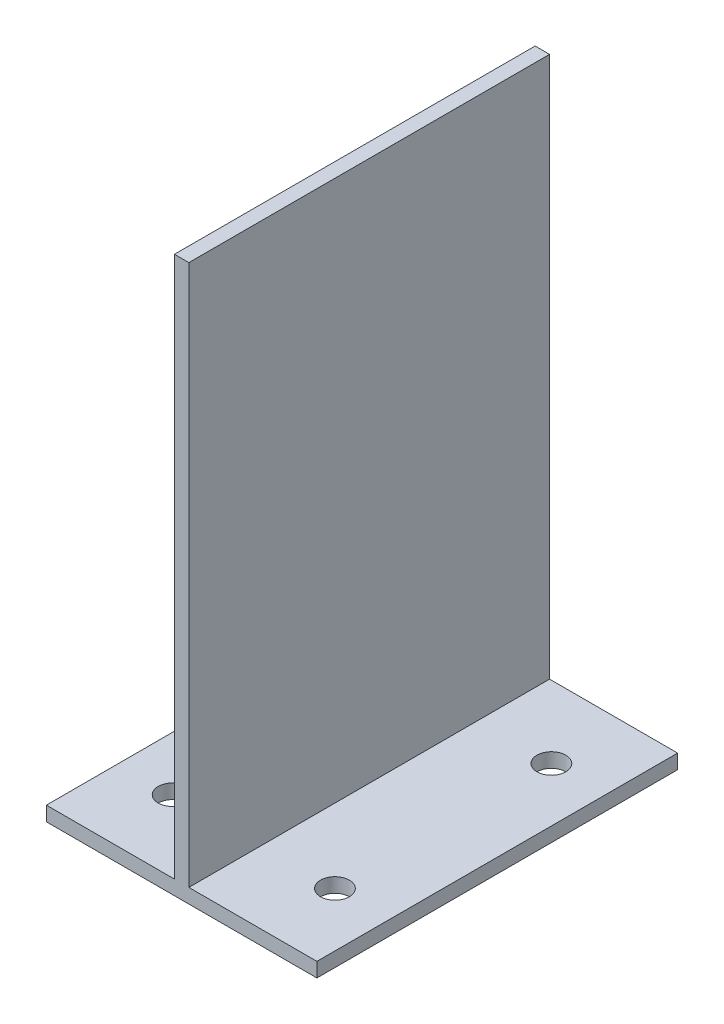
ISO-10303-21;
HEADER;
FILE_DESCRIPTION(('STEP AP214'),'2;1');
FILE_NAME('part.step','',(''),(''),'','','');
FILE_SCHEMA(('AUTOMOTIVE_DESIGN { 1 0 10303 214 1 1 1 1 }'));
ENDSEC;
DATA;
#1=APPLICATION_CONTEXT('core data for automotive mechanical design processes');
#2=APPLICATION_PROTOCOL_DEFINITION('international standard','automotive_design',2000,#1);
#3=PRODUCT_CONTEXT('',#1,'mechanical');
#4=PRODUCT('Part','Part','',(#3));
#5=PRODUCT_RELATED_PRODUCT_CATEGORY('part','',(#4));
#6=PRODUCT_DEFINITION_FORMATION('','',#4);
#7=PRODUCT_DEFINITION_CONTEXT('part definition',#1,'design');
#8=PRODUCT_DEFINITION('design','',#6,#7);
#9=PRODUCT_DEFINITION_SHAPE('','',#8);
#10=(LENGTH_UNIT() NAMED_UNIT(*) SI_UNIT(.MILLI.,.METRE.));
#11=(NAMED_UNIT(*) PLANE_ANGLE_UNIT() SI_UNIT($,.RADIAN.));
#12=(NAMED_UNIT(*) SI_UNIT($,.STERADIAN.) SOLID_ANGLE_UNIT());
#13=UNCERTAINTY_MEASURE_WITH_UNIT(LENGTH_MEASURE(1.E-05),#10,'distance_accuracy_value','');
#14=(GEOMETRIC_REPRESENTATION_CONTEXT(3) GLOBAL_UNCERTAINTY_ASSIGNED_CONTEXT((#13)) GLOBAL_UNIT_ASSIGNED_CONTEXT((#10,
#11,#12)) REPRESENTATION_CONTEXT('',''));
#15=CARTESIAN_POINT('',(0.,0.,0.));
#16=DIRECTION('',(0.,0.,1.));
#17=DIRECTION('',(1.,0.,0.));
#18=AXIS2_PLACEMENT_3D('',#15,#16,#17);
#19=CARTESIAN_POINT('',(4.,308.,200.));
#20=DIRECTION('',(0.,-1.,0.));
#21=DIRECTION('',(0.,0.,-1.));
#22=AXIS2_PLACEMENT_3D('',#19,#20,#21);
#23=PLANE('',#22);
#24=DIRECTION('',(-1.,0.,0.));
#25=VECTOR('',#24,1.);
#26=CARTESIAN_POINT('',(4.,308.,0.));
#27=LINE('',#26,#25);
#28=CARTESIAN_POINT('',(4.,308.,0.));
#29=VERTEX_POINT('',#28);
#30=CARTESIAN_POINT('',(-4.,308.,0.));
#31=VERTEX_POINT('',#30);
#32=EDGE_CURVE('E139',#29,#31,#27,.T.);
#33=ORIENTED_EDGE('',*,*,#32,.T.);
#34=DIRECTION('',(0.,0.,-1.));
#35=VECTOR('',#34,1.);
#36=CARTESIAN_POINT('',(-4.,308.,200.));
#37=LINE('',#36,#35);
#38=CARTESIAN_POINT('',(-4.,308.,200.));
#39=VERTEX_POINT('',#38);
#40=EDGE_CURVE('E11',#39,#31,#37,.T.);
#41=ORIENTED_EDGE('',*,*,#40,.F.);
#42=DIRECTION('',(-1.,0.,0.));
#43=VECTOR('',#42,1.);
#44=CARTESIAN_POINT('',(4.,308.,200.));
#45=LINE('',#44,#43);
#46=CARTESIAN_POINT('',(4.,308.,200.));
#47=VERTEX_POINT('',#46);
#48=EDGE_CURVE('E162',#47,#39,#45,.T.);
#49=ORIENTED_EDGE('',*,*,#48,.F.);
#50=DIRECTION('',(0.,0.,-1.));
#51=VECTOR('',#50,1.);
#52=CARTESIAN_POINT('',(4.,308.,200.));
#53=LINE('',#52,#51);
#54=EDGE_CURVE('E135',#47,#29,#53,.T.);
#55=ORIENTED_EDGE('',*,*,#54,.T.);
#56=EDGE_LOOP('',(#33,#41,#49,#55));
#57=FACE_BOUND('',#56,.T.);
#58=ADVANCED_FACE('F38',(#57),#23,.F.);
#59=CARTESIAN_POINT('',(-4.,308.,200.));
#60=DIRECTION('',(1.,0.,0.));
#61=DIRECTION('',(0.,1.,0.));
#62=AXIS2_PLACEMENT_3D('',#59,#60,#61);
#63=PLANE('',#62);
#64=DIRECTION('',(0.,-1.,0.));
#65=VECTOR('',#64,1.);
#66=CARTESIAN_POINT('',(-4.,308.,0.));
#67=LINE('',#66,#65);
#68=CARTESIAN_POINT('',(-4.00000000000004,8.,0.));
#69=VERTEX_POINT('',#68);
#70=EDGE_CURVE('E143',#31,#69,#67,.T.);
#71=ORIENTED_EDGE('',*,*,#70,.T.);
#72=DIRECTION('',(0.,0.,-1.));
#73=VECTOR('',#72,1.);
#74=CARTESIAN_POINT('',(-4.00000000000004,8.,200.));
#75=LINE('',#74,#73);
#76=CARTESIAN_POINT('',(-4.00000000000004,8.,200.));
#77=VERTEX_POINT('',#76);
#78=EDGE_CURVE('E47',#77,#69,#75,.T.);
#79=ORIENTED_EDGE('',*,*,#78,.F.);
#80=DIRECTION('',(0.,-1.,0.));
#81=VECTOR('',#80,1.);
#82=CARTESIAN_POINT('',(-4.,308.,200.));
#83=LINE('',#82,#81);
#84=EDGE_CURVE('E98',#39,#77,#83,.T.);
#85=ORIENTED_EDGE('',*,*,#84,.F.);
#86=ORIENTED_EDGE('',*,*,#40,.T.);
#87=EDGE_LOOP('',(#71,#79,#85,#86));
#88=FACE_BOUND('',#87,.T.);
#89=ADVANCED_FACE('F258',(#88),#63,.F.);
#90=CARTESIAN_POINT('',(-4.00000000000004,8.,200.));
#91=DIRECTION('',(0.,-1.,0.));
#92=DIRECTION('',(1.,0.,0.));
#93=AXIS2_PLACEMENT_3D('',#90,#91,#92);
#94=PLANE('',#93);
#95=CARTESIAN_POINT('',(-45.,7.99999999999999,160.));
#96=DIRECTION('',(0.,-1.,0.));
#97=DIRECTION('',(1.,0.,0.));
#98=AXIS2_PLACEMENT_3D('',#95,#96,#97);
#99=CIRCLE('',#98,7.99999999999997);
#100=CARTESIAN_POINT('',(-37.,8.,160.));
#101=VERTEX_POINT('',#100);
#102=EDGE_CURVE('E213',#101,#101,#99,.T.);
#103=ORIENTED_EDGE('',*,*,#102,.T.);
#104=EDGE_LOOP('',(#103));
#105=FACE_BOUND('',#104,.T.);
#106=CARTESIAN_POINT('',(-45.,7.99999999999999,40.));
#107=DIRECTION('',(0.,-1.,0.));
#108=DIRECTION('',(1.,0.,0.));
#109=AXIS2_PLACEMENT_3D('',#106,#107,#108);
#110=CIRCLE('',#109,7.99999999999997);
#111=CARTESIAN_POINT('',(-37.,8.,40.));
#112=VERTEX_POINT('',#111);
#113=EDGE_CURVE('E144',#112,#112,#110,.T.);
#114=ORIENTED_EDGE('',*,*,#113,.T.);
#115=EDGE_LOOP('',(#114));
#116=FACE_BOUND('',#115,.T.);
#117=DIRECTION('',(-1.,0.,0.));
#118=VECTOR('',#117,1.);
#119=CARTESIAN_POINT('',(-4.00000000000004,8.,0.));
#120=LINE('',#119,#118);
#121=CARTESIAN_POINT('',(-75.,7.99999999999999,0.));
#122=VERTEX_POINT('',#121);
#123=EDGE_CURVE('E147',#69,#122,#120,.T.);
#124=ORIENTED_EDGE('',*,*,#123,.T.);
#125=DIRECTION('',(0.,0.,-1.));
#126=VECTOR('',#125,1.);
#127=CARTESIAN_POINT('',(-75.,7.99999999999999,200.));
#128=LINE('',#127,#126);
#129=CARTESIAN_POINT('',(-75.,7.99999999999999,200.));
#130=VERTEX_POINT('',#129);
#131=EDGE_CURVE('E173',#130,#122,#128,.T.);
#132=ORIENTED_EDGE('',*,*,#131,.F.);
#133=DIRECTION('',(-1.,0.,0.));
#134=VECTOR('',#133,1.);
#135=CARTESIAN_POINT('',(-4.00000000000004,8.,200.));
#136=LINE('',#135,#134);
#137=EDGE_CURVE('E183',#77,#130,#136,.T.);
#138=ORIENTED_EDGE('',*,*,#137,.F.);
#139=ORIENTED_EDGE('',*,*,#78,.T.);
#140=EDGE_LOOP('',(#124,#132,#138,#139));
#141=FACE_BOUND('',#140,.T.);
#142=ADVANCED_FACE('F181',(#105,#116,#141),#94,.F.);
#143=CARTESIAN_POINT('',(-75.,7.99999999999999,200.));
#144=DIRECTION('',(1.,0.,0.));
#145=DIRECTION('',(0.,1.,0.));
#146=AXIS2_PLACEMENT_3D('',#143,#144,#145);
#147=PLANE('',#146);
#148=DIRECTION('',(0.,-1.,0.));
#149=VECTOR('',#148,1.);
#150=CARTESIAN_POINT('',(-75.,7.99999999999999,0.));
#151=LINE('',#150,#149);
#152=CARTESIAN_POINT('',(-75.,0.,0.));
#153=VERTEX_POINT('',#152);
#154=EDGE_CURVE('E150',#122,#153,#151,.T.);
#155=ORIENTED_EDGE('',*,*,#154,.T.);
#156=DIRECTION('',(0.,0.,-1.));
#157=VECTOR('',#156,1.);
#158=CARTESIAN_POINT('',(-75.,0.,200.));
#159=LINE('',#158,#157);
#160=CARTESIAN_POINT('',(-75.,0.,200.));
#161=VERTEX_POINT('',#160);
#162=EDGE_CURVE('E169',#161,#153,#159,.T.);
#163=ORIENTED_EDGE('',*,*,#162,.F.);
#164=DIRECTION('',(0.,-1.,0.));
#165=VECTOR('',#164,1.);
#166=CARTESIAN_POINT('',(-75.,7.99999999999999,200.));
#167=LINE('',#166,#165);
#168=EDGE_CURVE('E196',#130,#161,#167,.T.);
#169=ORIENTED_EDGE('',*,*,#168,.F.);
#170=ORIENTED_EDGE('',*,*,#131,.T.);
#171=EDGE_LOOP('',(#155,#163,#169,#170));
#172=FACE_BOUND('',#171,.T.);
#173=ADVANCED_FACE('F191',(#172),#147,.F.);
#174=CARTESIAN_POINT('',(-75.,0.,200.));
#175=DIRECTION('',(0.,1.,0.));
#176=DIRECTION('',(-1.,0.,0.));
#177=AXIS2_PLACEMENT_3D('',#174,#175,#176);
#178=PLANE('',#177);
#179=CARTESIAN_POINT('',(45.,0.,40.));
#180=DIRECTION('',(0.,-1.,0.));
#181=DIRECTION('',(0.,0.,-1.));
#182=AXIS2_PLACEMENT_3D('',#179,#180,#181);
#183=CIRCLE('',#182,7.99999999999999);
#184=CARTESIAN_POINT('',(45.,0.,32.));
#185=VERTEX_POINT('',#184);
#186=EDGE_CURVE('E233',#185,#185,#183,.T.);
#187=ORIENTED_EDGE('',*,*,#186,.F.);
#188=EDGE_LOOP('',(#187));
#189=FACE_BOUND('',#188,.T.);
#190=CARTESIAN_POINT('',(45.,0.,160.));
#191=DIRECTION('',(0.,-1.,0.));
#192=DIRECTION('',(0.,0.,-1.));
#193=AXIS2_PLACEMENT_3D('',#190,#191,#192);
#194=CIRCLE('',#193,7.99999999999999);
#195=CARTESIAN_POINT('',(45.,0.,152.));
#196=VERTEX_POINT('',#195);
#197=EDGE_CURVE('E225',#196,#196,#194,.T.);
#198=ORIENTED_EDGE('',*,*,#197,.F.);
#199=EDGE_LOOP('',(#198));
#200=FACE_BOUND('',#199,.T.);
#201=CARTESIAN_POINT('',(-45.,0.,160.));
#202=DIRECTION('',(0.,-1.,0.));
#203=DIRECTION('',(0.,0.,-1.));
#204=AXIS2_PLACEMENT_3D('',#201,#202,#203);
#205=CIRCLE('',#204,7.99999999999999);
#206=CARTESIAN_POINT('',(-45.,0.,152.));
#207=VERTEX_POINT('',#206);
#208=EDGE_CURVE('E217',#207,#207,#205,.T.);
#209=ORIENTED_EDGE('',*,*,#208,.F.);
#210=EDGE_LOOP('',(#209));
#211=FACE_BOUND('',#210,.T.);
#212=CARTESIAN_POINT('',(-45.,0.,40.));
#213=DIRECTION('',(0.,-1.,0.));
#214=DIRECTION('',(0.,0.,-1.));
#215=AXIS2_PLACEMENT_3D('',#212,#213,#214);
#216=CIRCLE('',#215,7.99999999999999);
#217=CARTESIAN_POINT('',(-45.,0.,32.));
#218=VERTEX_POINT('',#217);
#219=EDGE_CURVE('E209',#218,#218,#216,.T.);
#220=ORIENTED_EDGE('',*,*,#219,.F.);
#221=EDGE_LOOP('',(#220));
#222=FACE_BOUND('',#221,.T.);
#223=DIRECTION('',(1.,0.,0.));
#224=VECTOR('',#223,1.);
#225=CARTESIAN_POINT('',(-75.,0.,0.));
#226=LINE('',#225,#224);
#227=CARTESIAN_POINT('',(75.,0.,0.));
#228=VERTEX_POINT('',#227);
#229=EDGE_CURVE('E153',#153,#228,#226,.T.);
#230=ORIENTED_EDGE('',*,*,#229,.T.);
#231=DIRECTION('',(0.,0.,-1.));
#232=VECTOR('',#231,1.);
#233=CARTESIAN_POINT('',(75.,0.,200.));
#234=LINE('',#233,#232);
#235=CARTESIAN_POINT('',(75.,0.,200.));
#236=VERTEX_POINT('',#235);
#237=EDGE_CURVE('E128',#236,#228,#234,.T.);
#238=ORIENTED_EDGE('',*,*,#237,.F.);
#239=DIRECTION('',(1.,0.,0.));
#240=VECTOR('',#239,1.);
#241=CARTESIAN_POINT('',(-75.,0.,200.));
#242=LINE('',#241,#240);
#243=EDGE_CURVE('E117',#161,#236,#242,.T.);
#244=ORIENTED_EDGE('',*,*,#243,.F.);
#245=ORIENTED_EDGE('',*,*,#162,.T.);
#246=EDGE_LOOP('',(#230,#238,#244,#245));
#247=FACE_BOUND('',#246,.T.);
#248=ADVANCED_FACE('F194',(#189,#200,#211,#222,#247),#178,.F.);
#249=CARTESIAN_POINT('',(75.,0.,200.));
#250=DIRECTION('',(-1.,0.,0.));
#251=DIRECTION('',(0.,0.,1.));
#252=AXIS2_PLACEMENT_3D('',#249,#250,#251);
#253=PLANE('',#252);
#254=DIRECTION('',(0.,1.,0.));
#255=VECTOR('',#254,1.);
#256=CARTESIAN_POINT('',(75.,0.,0.));
#257=LINE('',#256,#255);
#258=CARTESIAN_POINT('',(75.,7.99999999999997,0.));
#259=VERTEX_POINT('',#258);
#260=EDGE_CURVE('E126',#228,#259,#257,.T.);
#261=ORIENTED_EDGE('',*,*,#260,.T.);
#262=DIRECTION('',(0.,0.,-1.));
#263=VECTOR('',#262,1.);
#264=CARTESIAN_POINT('',(75.,7.99999999999997,200.));
#265=LINE('',#264,#263);
#266=CARTESIAN_POINT('',(75.,7.99999999999997,200.));
#267=VERTEX_POINT('',#266);
#268=EDGE_CURVE('E123',#267,#259,#265,.T.);
#269=ORIENTED_EDGE('',*,*,#268,.F.);
#270=DIRECTION('',(0.,1.,0.));
#271=VECTOR('',#270,1.);
#272=CARTESIAN_POINT('',(75.,0.,200.));
#273=LINE('',#272,#271);
#274=EDGE_CURVE('E111',#236,#267,#273,.T.);
#275=ORIENTED_EDGE('',*,*,#274,.F.);
#276=ORIENTED_EDGE('',*,*,#237,.T.);
#277=EDGE_LOOP('',(#261,#269,#275,#276));
#278=FACE_BOUND('',#277,.T.);
#279=ADVANCED_FACE('F124',(#278),#253,.F.);
#280=CARTESIAN_POINT('',(75.,7.99999999999997,200.));
#281=DIRECTION('',(0.,-1.,0.));
#282=DIRECTION('',(1.,0.,0.));
#283=AXIS2_PLACEMENT_3D('',#280,#281,#282);
#284=PLANE('',#283);
#285=CARTESIAN_POINT('',(45.,7.99999999999998,40.));
#286=DIRECTION('',(0.,-1.,0.));
#287=DIRECTION('',(1.,0.,0.));
#288=AXIS2_PLACEMENT_3D('',#285,#286,#287);
#289=CIRCLE('',#288,7.99999999999997);
#290=CARTESIAN_POINT('',(53.,7.99999999999998,40.));
#291=VERTEX_POINT('',#290);
#292=EDGE_CURVE('E229',#291,#291,#289,.T.);
#293=ORIENTED_EDGE('',*,*,#292,.T.);
#294=EDGE_LOOP('',(#293));
#295=FACE_BOUND('',#294,.T.);
#296=CARTESIAN_POINT('',(45.,7.99999999999998,160.));
#297=DIRECTION('',(0.,-1.,0.));
#298=DIRECTION('',(1.,0.,0.));
#299=AXIS2_PLACEMENT_3D('',#296,#297,#298);
#300=CIRCLE('',#299,7.99999999999997);
#301=CARTESIAN_POINT('',(52.9999999999999,7.99999999999998,160.));
#302=VERTEX_POINT('',#301);
#303=EDGE_CURVE('E221',#302,#302,#300,.T.);
#304=ORIENTED_EDGE('',*,*,#303,.T.);
#305=EDGE_LOOP('',(#304));
#306=FACE_BOUND('',#305,.T.);
#307=DIRECTION('',(-1.,0.,0.));
#308=VECTOR('',#307,1.);
#309=CARTESIAN_POINT('',(75.,7.99999999999997,0.));
#310=LINE('',#309,#308);
#311=CARTESIAN_POINT('',(4.00000000000004,8.,0.));
#312=VERTEX_POINT('',#311);
#313=EDGE_CURVE('E84',#259,#312,#310,.T.);
#314=ORIENTED_EDGE('',*,*,#313,.T.);
#315=DIRECTION('',(0.,0.,-1.));
#316=VECTOR('',#315,1.);
#317=CARTESIAN_POINT('',(4.00000000000004,8.,200.));
#318=LINE('',#317,#316);
#319=CARTESIAN_POINT('',(4.00000000000004,8.,200.));
#320=VERTEX_POINT('',#319);
#321=EDGE_CURVE('E129',#320,#312,#318,.T.);
#322=ORIENTED_EDGE('',*,*,#321,.F.);
#323=DIRECTION('',(-1.,0.,0.));
#324=VECTOR('',#323,1.);
#325=CARTESIAN_POINT('',(75.,7.99999999999997,200.));
#326=LINE('',#325,#324);
#327=EDGE_CURVE('E115',#267,#320,#326,.T.);
#328=ORIENTED_EDGE('',*,*,#327,.F.);
#329=ORIENTED_EDGE('',*,*,#268,.T.);
#330=EDGE_LOOP('',(#314,#322,#328,#329));
#331=FACE_BOUND('',#330,.T.);
#332=ADVANCED_FACE('F131',(#295,#306,#331),#284,.F.);
#333=CARTESIAN_POINT('',(4.00000000000004,8.,200.));
#334=DIRECTION('',(-1.,0.,0.));
#335=DIRECTION('',(0.,-1.,0.));
#336=AXIS2_PLACEMENT_3D('',#333,#334,#335);
#337=PLANE('',#336);
#338=DIRECTION('',(0.,1.,0.));
#339=VECTOR('',#338,1.);
#340=CARTESIAN_POINT('',(4.00000000000004,8.,0.));
#341=LINE('',#340,#339);
#342=EDGE_CURVE('E90',#312,#29,#341,.T.);
#343=ORIENTED_EDGE('',*,*,#342,.T.);
#344=ORIENTED_EDGE('',*,*,#54,.F.);
#345=DIRECTION('',(0.,1.,0.));
#346=VECTOR('',#345,1.);
#347=CARTESIAN_POINT('',(4.00000000000004,8.,200.));
#348=LINE('',#347,#346);
#349=EDGE_CURVE('E55',#320,#47,#348,.T.);
#350=ORIENTED_EDGE('',*,*,#349,.F.);
#351=ORIENTED_EDGE('',*,*,#321,.T.);
#352=EDGE_LOOP('',(#343,#344,#350,#351));
#353=FACE_BOUND('',#352,.T.);
#354=ADVANCED_FACE('F273',(#353),#337,.F.);
#355=CARTESIAN_POINT('',(0.,0.,200.));
#356=DIRECTION('',(0.,0.,1.));
#357=DIRECTION('',(1.,0.,0.));
#358=AXIS2_PLACEMENT_3D('',#355,#356,#357);
#359=PLANE('',#358);
#360=ORIENTED_EDGE('',*,*,#48,.T.);
#361=ORIENTED_EDGE('',*,*,#84,.T.);
#362=ORIENTED_EDGE('',*,*,#137,.T.);
#363=ORIENTED_EDGE('',*,*,#168,.T.);
#364=ORIENTED_EDGE('',*,*,#243,.T.);
#365=ORIENTED_EDGE('',*,*,#274,.T.);
#366=ORIENTED_EDGE('',*,*,#327,.T.);
#367=ORIENTED_EDGE('',*,*,#349,.T.);
#368=EDGE_LOOP('',(#360,#361,#362,#363,#364,#365,#366,#367));
#369=FACE_BOUND('',#368,.T.);
#370=ADVANCED_FACE('F113',(#369),#359,.T.);
#371=CARTESIAN_POINT('',(0.,0.,0.));
#372=DIRECTION('',(0.,0.,1.));
#373=DIRECTION('',(1.,0.,0.));
#374=AXIS2_PLACEMENT_3D('',#371,#372,#373);
#375=PLANE('',#374);
#376=ORIENTED_EDGE('',*,*,#32,.F.);
#377=ORIENTED_EDGE('',*,*,#342,.F.);
#378=ORIENTED_EDGE('',*,*,#313,.F.);
#379=ORIENTED_EDGE('',*,*,#260,.F.);
#380=ORIENTED_EDGE('',*,*,#229,.F.);
#381=ORIENTED_EDGE('',*,*,#154,.F.);
#382=ORIENTED_EDGE('',*,*,#123,.F.);
#383=ORIENTED_EDGE('',*,*,#70,.F.);
#384=EDGE_LOOP('',(#376,#377,#378,#379,#380,#381,#382,#383));
#385=FACE_BOUND('',#384,.T.);
#386=ADVANCED_FACE('F187',(#385),#375,.F.);
#387=CARTESIAN_POINT('',(-45.,0.,40.));
#388=DIRECTION('',(0.,-1.,0.));
#389=DIRECTION('',(0.,0.,-1.));
#390=AXIS2_PLACEMENT_3D('',#387,#388,#389);
#391=CYLINDRICAL_SURFACE('',#390,7.99999999999997);
#392=ORIENTED_EDGE('',*,*,#219,.T.);
#393=EDGE_LOOP('',(#392));
#394=FACE_BOUND('',#393,.T.);
#395=ORIENTED_EDGE('',*,*,#113,.F.);
#396=EDGE_LOOP('',(#395));
#397=FACE_BOUND('',#396,.T.);
#398=ADVANCED_FACE('F250',(#394,#397),#391,.F.);
#399=CARTESIAN_POINT('',(-45.,0.,160.));
#400=DIRECTION('',(0.,-1.,0.));
#401=DIRECTION('',(0.,0.,-1.));
#402=AXIS2_PLACEMENT_3D('',#399,#400,#401);
#403=CYLINDRICAL_SURFACE('',#402,7.99999999999997);
#404=ORIENTED_EDGE('',*,*,#208,.T.);
#405=EDGE_LOOP('',(#404));
#406=FACE_BOUND('',#405,.T.);
#407=ORIENTED_EDGE('',*,*,#102,.F.);
#408=EDGE_LOOP('',(#407));
#409=FACE_BOUND('',#408,.T.);
#410=ADVANCED_FACE('F253',(#406,#409),#403,.F.);
#411=CARTESIAN_POINT('',(45.,0.,160.));
#412=DIRECTION('',(0.,-1.,0.));
#413=DIRECTION('',(0.,0.,-1.));
#414=AXIS2_PLACEMENT_3D('',#411,#412,#413);
#415=CYLINDRICAL_SURFACE('',#414,7.99999999999997);
#416=ORIENTED_EDGE('',*,*,#197,.T.);
#417=EDGE_LOOP('',(#416));
#418=FACE_BOUND('',#417,.T.);
#419=ORIENTED_EDGE('',*,*,#303,.F.);
#420=EDGE_LOOP('',(#419));
#421=FACE_BOUND('',#420,.T.);
#422=ADVANCED_FACE('F315',(#418,#421),#415,.F.);
#423=CARTESIAN_POINT('',(45.,0.,40.));
#424=DIRECTION('',(0.,-1.,0.));
#425=DIRECTION('',(0.,0.,-1.));
#426=AXIS2_PLACEMENT_3D('',#423,#424,#425);
#427=CYLINDRICAL_SURFACE('',#426,7.99999999999997);
#428=ORIENTED_EDGE('',*,*,#186,.T.);
#429=EDGE_LOOP('',(#428));
#430=FACE_BOUND('',#429,.T.);
#431=ORIENTED_EDGE('',*,*,#292,.F.);
#432=EDGE_LOOP('',(#431));
#433=FACE_BOUND('',#432,.T.);
#434=ADVANCED_FACE('F238',(#430,#433),#427,.F.);
#435=CLOSED_SHELL('',(#58,#89,#142,#173,#248,#279,#332,#354,#370,#386,#398,#410,#422,#434));
#436=MANIFOLD_SOLID_BREP('B2',#435);
#437=ADVANCED_BREP_SHAPE_REPRESENTATION('',(#18,#436),#14);
#438=SHAPE_DEFINITION_REPRESENTATION(#9,#437);
ENDSEC;
END-ISO-10303-21;
